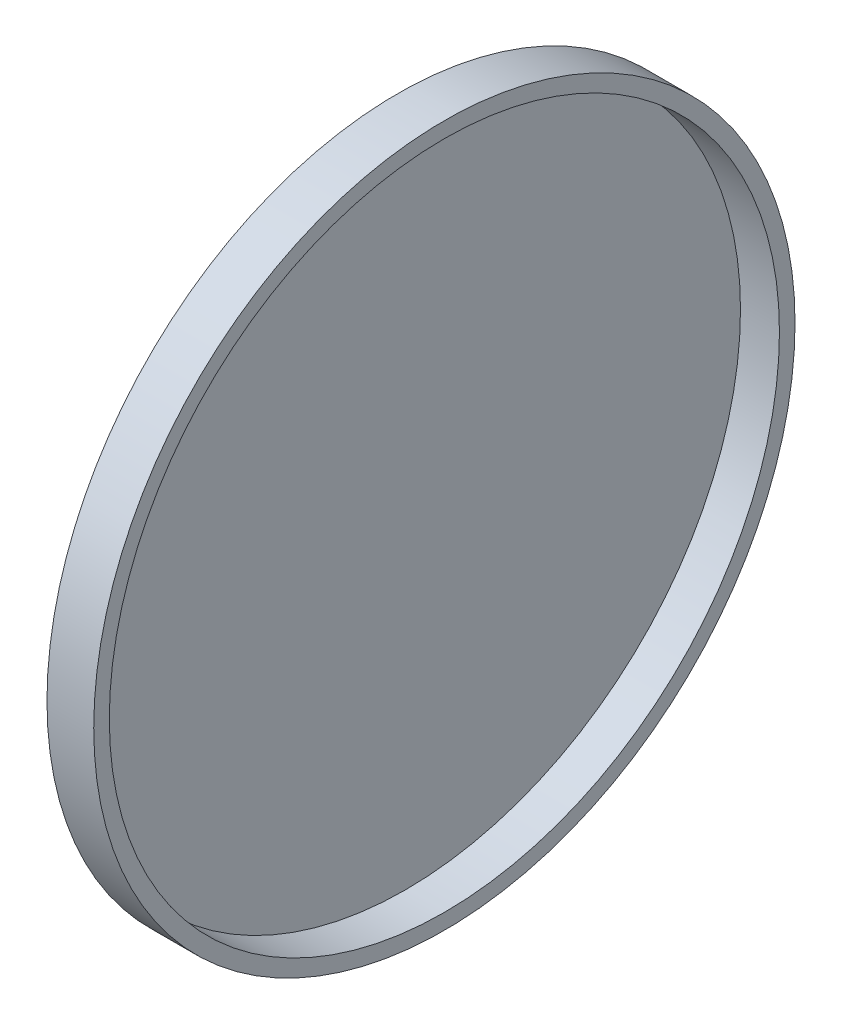
ISO-10303-21;
HEADER;
FILE_DESCRIPTION(('STEP AP214'),'2;1');
FILE_NAME('part.step','',(''),(''),'','','');
FILE_SCHEMA(('AUTOMOTIVE_DESIGN { 1 0 10303 214 1 1 1 1 }'));
ENDSEC;
DATA;
#1=APPLICATION_CONTEXT('core data for automotive mechanical design processes');
#2=APPLICATION_PROTOCOL_DEFINITION('international standard','automotive_design',2000,#1);
#3=PRODUCT_CONTEXT('',#1,'mechanical');
#4=PRODUCT('Part','Part','',(#3));
#5=PRODUCT_RELATED_PRODUCT_CATEGORY('part','',(#4));
#6=PRODUCT_DEFINITION_FORMATION('','',#4);
#7=PRODUCT_DEFINITION_CONTEXT('part definition',#1,'design');
#8=PRODUCT_DEFINITION('design','',#6,#7);
#9=PRODUCT_DEFINITION_SHAPE('','',#8);
#10=(LENGTH_UNIT() NAMED_UNIT(*) SI_UNIT(.MILLI.,.METRE.));
#11=(NAMED_UNIT(*) PLANE_ANGLE_UNIT() SI_UNIT($,.RADIAN.));
#12=(NAMED_UNIT(*) SI_UNIT($,.STERADIAN.) SOLID_ANGLE_UNIT());
#13=UNCERTAINTY_MEASURE_WITH_UNIT(LENGTH_MEASURE(1.E-05),#10,'distance_accuracy_value','');
#14=(GEOMETRIC_REPRESENTATION_CONTEXT(3) GLOBAL_UNCERTAINTY_ASSIGNED_CONTEXT((#13)) GLOBAL_UNIT_ASSIGNED_CONTEXT((#10,
#11,#12)) REPRESENTATION_CONTEXT('',''));
#15=CARTESIAN_POINT('',(0.,0.,0.));
#16=DIRECTION('',(0.,0.,1.));
#17=DIRECTION('',(1.,0.,0.));
#18=AXIS2_PLACEMENT_3D('',#15,#16,#17);
#19=CARTESIAN_POINT('',(5.,0.,0.));
#20=DIRECTION('',(1.,0.,0.));
#21=DIRECTION('',(0.,0.,-1.));
#22=AXIS2_PLACEMENT_3D('',#19,#20,#21);
#23=PLANE('',#22);
#24=CARTESIAN_POINT('',(5.,0.,0.));
#25=DIRECTION('',(1.,0.,0.));
#26=DIRECTION('',(0.,0.,-1.));
#27=AXIS2_PLACEMENT_3D('',#24,#25,#26);
#28=CIRCLE('',#27,45.);
#29=CARTESIAN_POINT('',(5.,0.,-45.));
#30=VERTEX_POINT('',#29);
#31=EDGE_CURVE('E10',#30,#30,#28,.T.);
#32=ORIENTED_EDGE('',*,*,#31,.T.);
#33=EDGE_LOOP('',(#32));
#34=FACE_BOUND('',#33,.T.);
#35=CARTESIAN_POINT('',(5.,0.,0.));
#36=DIRECTION('',(1.,0.,0.));
#37=DIRECTION('',(0.,0.,-1.));
#38=AXIS2_PLACEMENT_3D('',#35,#36,#37);
#39=CIRCLE('',#38,43.);
#40=CARTESIAN_POINT('',(5.,0.,-43.));
#41=VERTEX_POINT('',#40);
#42=EDGE_CURVE('E38',#41,#41,#39,.T.);
#43=ORIENTED_EDGE('',*,*,#42,.F.);
#44=EDGE_LOOP('',(#43));
#45=FACE_BOUND('',#44,.T.);
#46=ADVANCED_FACE('F31',(#34,#45),#23,.T.);
#47=CARTESIAN_POINT('',(5.,0.,0.));
#48=DIRECTION('',(-1.,0.,0.));
#49=DIRECTION('',(0.,0.,1.));
#50=AXIS2_PLACEMENT_3D('',#47,#48,#49);
#51=CYLINDRICAL_SURFACE('',#50,45.);
#52=ORIENTED_EDGE('',*,*,#31,.F.);
#53=EDGE_LOOP('',(#52));
#54=FACE_BOUND('',#53,.T.);
#55=CARTESIAN_POINT('',(-1.,0.,0.));
#56=DIRECTION('',(-1.,0.,0.));
#57=DIRECTION('',(0.,0.,1.));
#58=AXIS2_PLACEMENT_3D('',#55,#56,#57);
#59=CIRCLE('',#58,45.);
#60=CARTESIAN_POINT('',(-1.,0.,45.));
#61=VERTEX_POINT('',#60);
#62=EDGE_CURVE('E47',#61,#61,#59,.T.);
#63=ORIENTED_EDGE('',*,*,#62,.F.);
#64=EDGE_LOOP('',(#63));
#65=FACE_BOUND('',#64,.T.);
#66=ADVANCED_FACE('F33',(#54,#65),#51,.T.);
#67=CARTESIAN_POINT('',(5.,0.,0.));
#68=DIRECTION('',(-1.,0.,0.));
#69=DIRECTION('',(0.,0.,1.));
#70=AXIS2_PLACEMENT_3D('',#67,#68,#69);
#71=CYLINDRICAL_SURFACE('',#70,43.);
#72=ORIENTED_EDGE('',*,*,#42,.T.);
#73=EDGE_LOOP('',(#72));
#74=FACE_BOUND('',#73,.T.);
#75=CARTESIAN_POINT('',(0.,0.,0.));
#76=DIRECTION('',(1.,0.,0.));
#77=DIRECTION('',(0.,0.,-1.));
#78=AXIS2_PLACEMENT_3D('',#75,#76,#77);
#79=CIRCLE('',#78,43.);
#80=CARTESIAN_POINT('',(0.,0.,-43.));
#81=VERTEX_POINT('',#80);
#82=EDGE_CURVE('E42',#81,#81,#79,.T.);
#83=ORIENTED_EDGE('',*,*,#82,.F.);
#84=EDGE_LOOP('',(#83));
#85=FACE_BOUND('',#84,.T.);
#86=ADVANCED_FACE('F55',(#74,#85),#71,.F.);
#87=CARTESIAN_POINT('',(0.,0.,0.));
#88=DIRECTION('',(-1.,0.,0.));
#89=DIRECTION('',(0.,0.,1.));
#90=AXIS2_PLACEMENT_3D('',#87,#88,#89);
#91=PLANE('',#90);
#92=ORIENTED_EDGE('',*,*,#82,.T.);
#93=EDGE_LOOP('',(#92));
#94=FACE_BOUND('',#93,.T.);
#95=ADVANCED_FACE('F61',(#94),#91,.F.);
#96=CARTESIAN_POINT('',(-1.,0.,0.));
#97=DIRECTION('',(-1.,0.,0.));
#98=DIRECTION('',(0.,0.,1.));
#99=AXIS2_PLACEMENT_3D('',#96,#97,#98);
#100=PLANE('',#99);
#101=ORIENTED_EDGE('',*,*,#62,.T.);
#102=EDGE_LOOP('',(#101));
#103=FACE_BOUND('',#102,.T.);
#104=ADVANCED_FACE('F52',(#103),#100,.T.);
#105=CLOSED_SHELL('',(#46,#66,#86,#95,#104));
#106=MANIFOLD_SOLID_BREP('B2',#105);
#107=ADVANCED_BREP_SHAPE_REPRESENTATION('',(#18,#106),#14);
#108=SHAPE_DEFINITION_REPRESENTATION(#9,#107);
ENDSEC;
END-ISO-10303-21;
